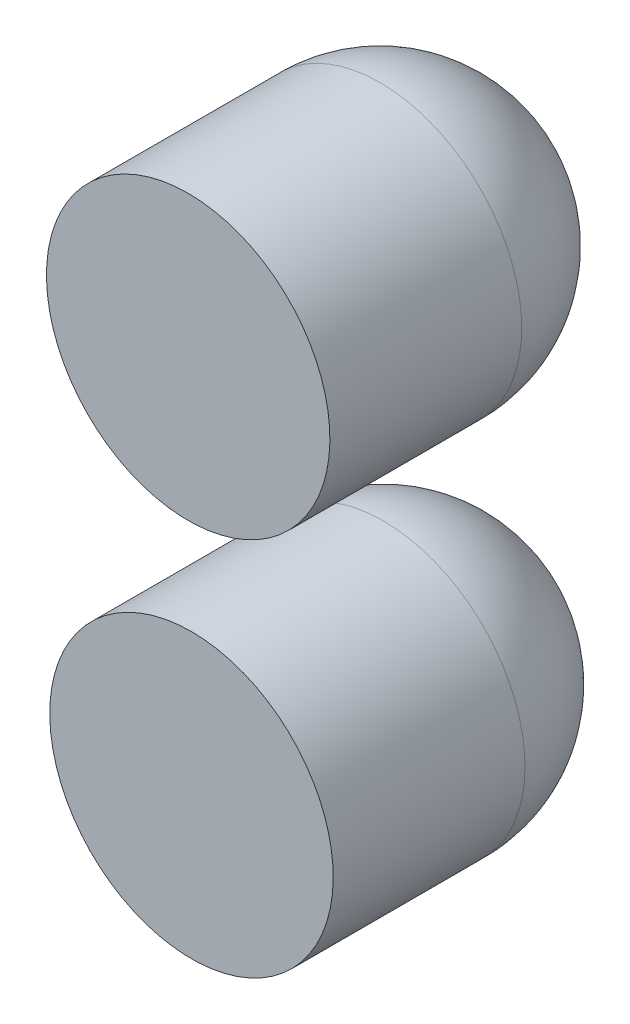
ISO-10303-21;
HEADER;
FILE_DESCRIPTION(('STEP AP214'),'2;1');
FILE_NAME('part.step','',(''),(''),'','','');
FILE_SCHEMA(('AUTOMOTIVE_DESIGN { 1 0 10303 214 1 1 1 1 }'));
ENDSEC;
DATA;
#1=APPLICATION_CONTEXT('core data for automotive mechanical design processes');
#2=APPLICATION_PROTOCOL_DEFINITION('international standard','automotive_design',2000,#1);
#3=PRODUCT_CONTEXT('',#1,'mechanical');
#4=PRODUCT('Part','Part','',(#3));
#5=PRODUCT_RELATED_PRODUCT_CATEGORY('part','',(#4));
#6=PRODUCT_DEFINITION_FORMATION('','',#4);
#7=PRODUCT_DEFINITION_CONTEXT('part definition',#1,'design');
#8=PRODUCT_DEFINITION('design','',#6,#7);
#9=PRODUCT_DEFINITION_SHAPE('','',#8);
#10=(LENGTH_UNIT() NAMED_UNIT(*) SI_UNIT(.MILLI.,.METRE.));
#11=(NAMED_UNIT(*) PLANE_ANGLE_UNIT() SI_UNIT($,.RADIAN.));
#12=(NAMED_UNIT(*) SI_UNIT($,.STERADIAN.) SOLID_ANGLE_UNIT());
#13=UNCERTAINTY_MEASURE_WITH_UNIT(LENGTH_MEASURE(1.E-05),#10,'distance_accuracy_value','');
#14=(GEOMETRIC_REPRESENTATION_CONTEXT(3) GLOBAL_UNCERTAINTY_ASSIGNED_CONTEXT((#13)) GLOBAL_UNIT_ASSIGNED_CONTEXT((#10,
#11,#12)) REPRESENTATION_CONTEXT('',''));
#15=CARTESIAN_POINT('',(0.,0.,0.));
#16=DIRECTION('',(0.,0.,1.));
#17=DIRECTION('',(1.,0.,0.));
#18=AXIS2_PLACEMENT_3D('',#15,#16,#17);
#19=CARTESIAN_POINT('',(3.83704731833573,5.09306722373618,-5.06997500000009));
#20=DIRECTION('',(0.999961923064171,0.00872653549837334,0.));
#21=DIRECTION('',(-0.00872653549837334,0.999961923064171,0.));
#22=AXIS2_PLACEMENT_3D('',#19,#20,#21);
#23=SPHERICAL_SURFACE('',#22,1.5);
#24=CARTESIAN_POINT('',(3.83704731833573,5.09306722373618,-5.06997500000009));
#25=DIRECTION('',(0.,0.,-1.));
#26=DIRECTION('',(0.,1.,0.));
#27=AXIS2_PLACEMENT_3D('',#24,#25,#26);
#28=CIRCLE('',#27,1.5);
#29=CARTESIAN_POINT('',(2.33710443373947,5.07997742048862,-5.06997500000009));
#30=VERTEX_POINT('',#29);
#31=CARTESIAN_POINT('',(5.33699020293199,5.10615702698374,-5.06997500000009));
#32=VERTEX_POINT('',#31);
#33=EDGE_CURVE('P0_E30',#30,#32,#28,.F.);
#34=ORIENTED_EDGE('',*,*,#33,.F.);
#35=CARTESIAN_POINT('',(3.83704731833573,5.09306722373618,-5.06997500000009));
#36=DIRECTION('',(0.,0.,-1.));
#37=DIRECTION('',(0.,1.,0.));
#38=AXIS2_PLACEMENT_3D('',#35,#36,#37);
#39=CIRCLE('',#38,1.5);
#40=EDGE_CURVE('P0_E24',#32,#30,#39,.F.);
#41=ORIENTED_EDGE('',*,*,#40,.F.);
#42=EDGE_LOOP('',(#34,#41));
#43=FACE_BOUND('',#42,.T.);
#44=ADVANCED_FACE('P0_F17',(#43),#23,.T.);
#45=CARTESIAN_POINT('',(3.81959424733899,7.09299106986451,-3.03997500000009));
#46=DIRECTION('',(0.,0.,-1.));
#47=DIRECTION('',(0.,1.,0.));
#48=AXIS2_PLACEMENT_3D('',#45,#46,#47);
#49=PLANE('',#48);
#50=CARTESIAN_POINT('',(3.83704731833573,5.09306722373617,-3.03997500000009));
#51=DIRECTION('',(0.,0.,-1.));
#52=DIRECTION('',(0.,1.,0.));
#53=AXIS2_PLACEMENT_3D('',#50,#51,#52);
#54=CIRCLE('',#53,1.5);
#55=CARTESIAN_POINT('',(3.83704731833573,6.59306722373617,-3.03997500000008));
#56=VERTEX_POINT('',#55);
#57=EDGE_CURVE('P0_E11',#56,#56,#54,.T.);
#58=ORIENTED_EDGE('',*,*,#57,.F.);
#59=EDGE_LOOP('',(#58));
#60=FACE_BOUND('',#59,.T.);
#61=ADVANCED_FACE('P0_F43',(#60),#49,.F.);
#62=CARTESIAN_POINT('',(3.83704731833573,5.09306722373618,-4.52997500000009));
#63=DIRECTION('',(0.,0.,-1.));
#64=DIRECTION('',(0.,1.,0.));
#65=AXIS2_PLACEMENT_3D('',#62,#63,#64);
#66=CYLINDRICAL_SURFACE('',#65,1.5);
#67=ORIENTED_EDGE('',*,*,#33,.T.);
#68=ORIENTED_EDGE('',*,*,#40,.T.);
#69=EDGE_LOOP('',(#67,#68));
#70=FACE_BOUND('',#69,.T.);
#71=ORIENTED_EDGE('',*,*,#57,.T.);
#72=EDGE_LOOP('',(#71));
#73=FACE_BOUND('',#72,.T.);
#74=ADVANCED_FACE('P0_F33',(#70,#73),#66,.T.);
#75=CLOSED_SHELL('',(#44,#61,#74));
#76=MANIFOLD_SOLID_BREP('P0_B1',#75);
#77=CARTESIAN_POINT('',(3.81959424733899,7.09299106986451,-3.03997500000009));
#78=DIRECTION('',(0.,0.,-1.));
#79=DIRECTION('',(0.,1.,0.));
#80=AXIS2_PLACEMENT_3D('',#77,#78,#79);
#81=PLANE('',#80);
#82=CARTESIAN_POINT('',(3.80214117634224,9.09291491599286,-3.03997500000008));
#83=DIRECTION('',(0.,0.,-1.));
#84=DIRECTION('',(0.,1.,0.));
#85=AXIS2_PLACEMENT_3D('',#82,#83,#84);
#86=CIRCLE('',#85,1.5);
#87=CARTESIAN_POINT('',(3.80214117634224,10.5929149159929,-3.03997500000007));
#88=VERTEX_POINT('',#87);
#89=EDGE_CURVE('P1_E20',#88,#88,#86,.T.);
#90=ORIENTED_EDGE('',*,*,#89,.F.);
#91=EDGE_LOOP('',(#90));
#92=FACE_BOUND('',#91,.T.);
#93=ADVANCED_FACE('P1_F17',(#92),#81,.F.);
#94=CARTESIAN_POINT('',(3.80214117634224,9.09291491599286,-5.06997500000008));
#95=DIRECTION('',(0.999961923064171,0.00872653549837334,0.));
#96=DIRECTION('',(-0.00872653549837334,0.999961923064171,0.));
#97=AXIS2_PLACEMENT_3D('',#94,#95,#96);
#98=SPHERICAL_SURFACE('',#97,1.5);
#99=CARTESIAN_POINT('',(3.80214117634224,9.09291491599286,-5.06997500000008));
#100=DIRECTION('',(0.,0.,-1.));
#101=DIRECTION('',(0.,1.,0.));
#102=AXIS2_PLACEMENT_3D('',#99,#100,#101);
#103=CIRCLE('',#102,1.5);
#104=CARTESIAN_POINT('',(2.30219829174598,9.0798251127453,-5.06997500000008));
#105=VERTEX_POINT('',#104);
#106=CARTESIAN_POINT('',(5.3020840609385,9.10600471924042,-5.06997500000008));
#107=VERTEX_POINT('',#106);
#108=EDGE_CURVE('P1_E11',#105,#107,#103,.F.);
#109=ORIENTED_EDGE('',*,*,#108,.F.);
#110=CARTESIAN_POINT('',(3.80214117634224,9.09291491599286,-5.06997500000008));
#111=DIRECTION('',(0.,0.,-1.));
#112=DIRECTION('',(0.,1.,0.));
#113=AXIS2_PLACEMENT_3D('',#110,#111,#112);
#114=CIRCLE('',#113,1.5);
#115=EDGE_CURVE('P1_E30',#107,#105,#114,.F.);
#116=ORIENTED_EDGE('',*,*,#115,.F.);
#117=EDGE_LOOP('',(#109,#116));
#118=FACE_BOUND('',#117,.T.);
#119=ADVANCED_FACE('P1_F33',(#118),#98,.T.);
#120=CARTESIAN_POINT('',(3.80214117634224,9.09291491599286,-4.52997500000008));
#121=DIRECTION('',(0.,0.,-1.));
#122=DIRECTION('',(0.,1.,0.));
#123=AXIS2_PLACEMENT_3D('',#120,#121,#122);
#124=CYLINDRICAL_SURFACE('',#123,1.5);
#125=ORIENTED_EDGE('',*,*,#89,.T.);
#126=EDGE_LOOP('',(#125));
#127=FACE_BOUND('',#126,.T.);
#128=ORIENTED_EDGE('',*,*,#108,.T.);
#129=ORIENTED_EDGE('',*,*,#115,.T.);
#130=EDGE_LOOP('',(#128,#129));
#131=FACE_BOUND('',#130,.T.);
#132=ADVANCED_FACE('P1_F35',(#127,#131),#124,.T.);
#133=CLOSED_SHELL('',(#93,#119,#132));
#134=MANIFOLD_SOLID_BREP('P1_B1',#133);
#135=ADVANCED_BREP_SHAPE_REPRESENTATION('',(#18,#76,#134),#14);
#136=SHAPE_DEFINITION_REPRESENTATION(#9,#135);
ENDSEC;
END-ISO-10303-21;
